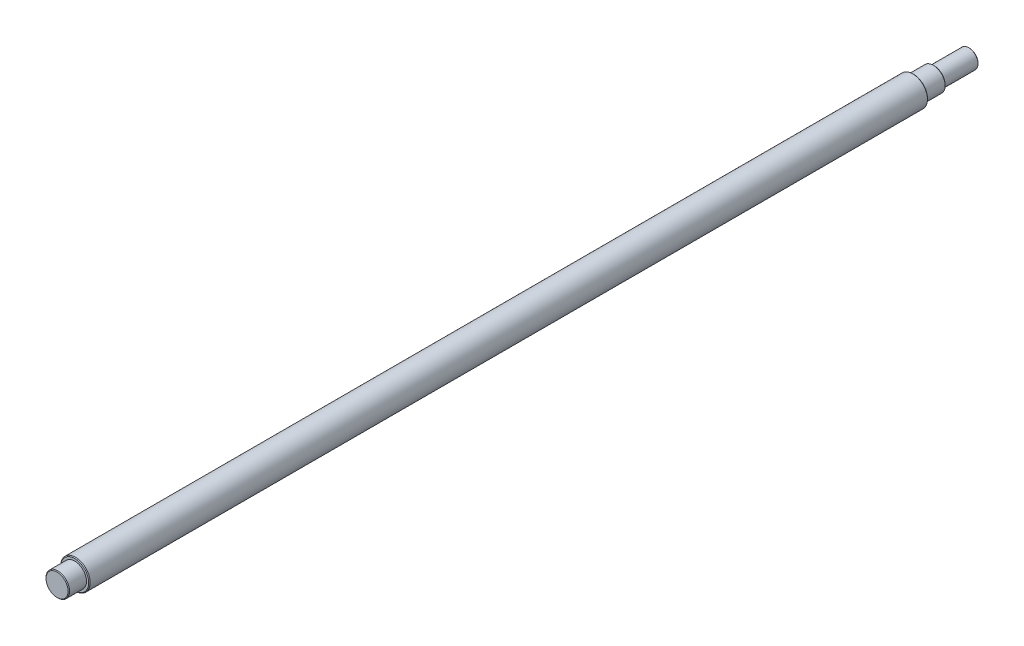
ISO-10303-21;
HEADER;
FILE_DESCRIPTION(('STEP AP214'),'2;1');
FILE_NAME('part.step','',(''),(''),'','','');
FILE_SCHEMA(('AUTOMOTIVE_DESIGN { 1 0 10303 214 1 1 1 1 }'));
ENDSEC;
DATA;
#1=APPLICATION_CONTEXT('core data for automotive mechanical design processes');
#2=APPLICATION_PROTOCOL_DEFINITION('international standard','automotive_design',2000,#1);
#3=PRODUCT_CONTEXT('',#1,'mechanical');
#4=PRODUCT('Part','Part','',(#3));
#5=PRODUCT_RELATED_PRODUCT_CATEGORY('part','',(#4));
#6=PRODUCT_DEFINITION_FORMATION('','',#4);
#7=PRODUCT_DEFINITION_CONTEXT('part definition',#1,'design');
#8=PRODUCT_DEFINITION('design','',#6,#7);
#9=PRODUCT_DEFINITION_SHAPE('','',#8);
#10=(LENGTH_UNIT() NAMED_UNIT(*) SI_UNIT(.MILLI.,.METRE.));
#11=(NAMED_UNIT(*) PLANE_ANGLE_UNIT() SI_UNIT($,.RADIAN.));
#12=(NAMED_UNIT(*) SI_UNIT($,.STERADIAN.) SOLID_ANGLE_UNIT());
#13=UNCERTAINTY_MEASURE_WITH_UNIT(LENGTH_MEASURE(1.E-05),#10,'distance_accuracy_value','');
#14=(GEOMETRIC_REPRESENTATION_CONTEXT(3) GLOBAL_UNCERTAINTY_ASSIGNED_CONTEXT((#13)) GLOBAL_UNIT_ASSIGNED_CONTEXT((#10,
#11,#12)) REPRESENTATION_CONTEXT('',''));
#15=CARTESIAN_POINT('',(0.,0.,0.));
#16=DIRECTION('',(0.,0.,1.));
#17=DIRECTION('',(1.,0.,0.));
#18=AXIS2_PLACEMENT_3D('',#15,#16,#17);
#19=CARTESIAN_POINT('',(0.,0.,304.));
#20=DIRECTION('',(0.,0.,-1.));
#21=DIRECTION('',(-1.,0.,0.));
#22=AXIS2_PLACEMENT_3D('',#19,#20,#21);
#23=PLANE('',#22);
#24=CARTESIAN_POINT('',(0.,0.,304.));
#25=DIRECTION('',(0.,0.,-1.));
#26=DIRECTION('',(-1.,0.,0.));
#27=AXIS2_PLACEMENT_3D('',#24,#25,#26);
#28=CIRCLE('',#27,4.74999999995607);
#29=CARTESIAN_POINT('',(-4.74999999995607,0.,304.));
#30=VERTEX_POINT('',#29);
#31=EDGE_CURVE('E65',#30,#30,#28,.F.);
#32=ORIENTED_EDGE('',*,*,#31,.T.);
#33=EDGE_LOOP('',(#32));
#34=FACE_BOUND('',#33,.T.);
#35=CARTESIAN_POINT('',(0.,0.,304.));
#36=DIRECTION('',(0.,0.,-1.));
#37=DIRECTION('',(-1.,0.,0.));
#38=AXIS2_PLACEMENT_3D('',#35,#36,#37);
#39=CIRCLE('',#38,4.);
#40=CARTESIAN_POINT('',(-4.,0.,304.));
#41=VERTEX_POINT('',#40);
#42=EDGE_CURVE('E68',#41,#41,#39,.F.);
#43=ORIENTED_EDGE('',*,*,#42,.F.);
#44=EDGE_LOOP('',(#43));
#45=FACE_BOUND('',#44,.T.);
#46=ADVANCED_FACE('F30',(#34,#45),#23,.F.);
#47=CARTESIAN_POINT('',(0.,0.,12.));
#48=DIRECTION('',(0.,0.,-1.));
#49=DIRECTION('',(-1.,0.,0.));
#50=AXIS2_PLACEMENT_3D('',#47,#48,#49);
#51=PLANE('',#50);
#52=CARTESIAN_POINT('',(0.,0.,12.));
#53=DIRECTION('',(0.,0.,-1.));
#54=DIRECTION('',(-1.,0.,0.));
#55=AXIS2_PLACEMENT_3D('',#52,#53,#54);
#56=CIRCLE('',#55,3.7499999999562);
#57=CARTESIAN_POINT('',(-3.7499999999562,0.,12.));
#58=VERTEX_POINT('',#57);
#59=EDGE_CURVE('E37',#58,#58,#56,.T.);
#60=ORIENTED_EDGE('',*,*,#59,.T.);
#61=EDGE_LOOP('',(#60));
#62=FACE_BOUND('',#61,.T.);
#63=CARTESIAN_POINT('',(0.,0.,12.));
#64=DIRECTION('',(0.,0.,-1.));
#65=DIRECTION('',(-1.,0.,0.));
#66=AXIS2_PLACEMENT_3D('',#63,#64,#65);
#67=CIRCLE('',#66,3.175);
#68=CARTESIAN_POINT('',(-3.175,0.,12.));
#69=VERTEX_POINT('',#68);
#70=EDGE_CURVE('E74',#69,#69,#67,.T.);
#71=ORIENTED_EDGE('',*,*,#70,.F.);
#72=EDGE_LOOP('',(#71));
#73=FACE_BOUND('',#72,.T.);
#74=ADVANCED_FACE('F80',(#62,#73),#51,.T.);
#75=CARTESIAN_POINT('',(0.,0.,19.));
#76=DIRECTION('',(0.,0.,-1.));
#77=DIRECTION('',(-1.,0.,0.));
#78=AXIS2_PLACEMENT_3D('',#75,#76,#77);
#79=PLANE('',#78);
#80=CARTESIAN_POINT('',(0.,0.,19.));
#81=DIRECTION('',(0.,0.,-1.));
#82=DIRECTION('',(-1.,0.,0.));
#83=AXIS2_PLACEMENT_3D('',#80,#81,#82);
#84=CIRCLE('',#83,4.74999999995609);
#85=CARTESIAN_POINT('',(-4.74999999995609,0.,19.));
#86=VERTEX_POINT('',#85);
#87=EDGE_CURVE('E50',#86,#86,#84,.T.);
#88=ORIENTED_EDGE('',*,*,#87,.T.);
#89=EDGE_LOOP('',(#88));
#90=FACE_BOUND('',#89,.T.);
#91=CARTESIAN_POINT('',(0.,0.,19.));
#92=DIRECTION('',(0.,0.,-1.));
#93=DIRECTION('',(-1.,0.,0.));
#94=AXIS2_PLACEMENT_3D('',#91,#92,#93);
#95=CIRCLE('',#94,4.);
#96=CARTESIAN_POINT('',(4.,0.,19.));
#97=VERTEX_POINT('',#96);
#98=EDGE_CURVE('E71',#97,#97,#95,.T.);
#99=ORIENTED_EDGE('',*,*,#98,.F.);
#100=EDGE_LOOP('',(#99));
#101=FACE_BOUND('',#100,.T.);
#102=ADVANCED_FACE('F82',(#90,#101),#79,.T.);
#103=CARTESIAN_POINT('',(0.,0.,19.));
#104=DIRECTION('',(0.,0.,1.));
#105=DIRECTION('',(1.,0.,0.));
#106=AXIS2_PLACEMENT_3D('',#103,#104,#105);
#107=CYLINDRICAL_SURFACE('',#106,5.);
#108=CARTESIAN_POINT('',(0.,0.,303.749999999956));
#109=DIRECTION('',(0.,0.,-1.));
#110=DIRECTION('',(-1.,0.,0.));
#111=AXIS2_PLACEMENT_3D('',#108,#109,#110);
#112=CIRCLE('',#111,5.);
#113=CARTESIAN_POINT('',(-5.,0.,303.749999999956));
#114=VERTEX_POINT('',#113);
#115=EDGE_CURVE('E59',#114,#114,#112,.T.);
#116=ORIENTED_EDGE('',*,*,#115,.T.);
#117=EDGE_LOOP('',(#116));
#118=FACE_BOUND('',#117,.T.);
#119=CARTESIAN_POINT('',(0.,0.,19.2500000000439));
#120=DIRECTION('',(0.,0.,-1.));
#121=DIRECTION('',(-1.,0.,0.));
#122=AXIS2_PLACEMENT_3D('',#119,#120,#121);
#123=CIRCLE('',#122,5.);
#124=CARTESIAN_POINT('',(-5.,0.,19.2500000000439));
#125=VERTEX_POINT('',#124);
#126=EDGE_CURVE('E62',#125,#125,#123,.F.);
#127=ORIENTED_EDGE('',*,*,#126,.T.);
#128=EDGE_LOOP('',(#127));
#129=FACE_BOUND('',#128,.T.);
#130=ADVANCED_FACE('F88',(#118,#129),#107,.T.);
#131=CARTESIAN_POINT('',(0.,0.,12.));
#132=DIRECTION('',(0.,0.,1.));
#133=DIRECTION('',(1.,0.,0.));
#134=AXIS2_PLACEMENT_3D('',#131,#132,#133);
#135=CYLINDRICAL_SURFACE('',#134,4.);
#136=CARTESIAN_POINT('',(0.,0.,12.2500000000438));
#137=DIRECTION('',(0.,0.,-1.));
#138=DIRECTION('',(-1.,0.,0.));
#139=AXIS2_PLACEMENT_3D('',#136,#137,#138);
#140=CIRCLE('',#139,4.);
#141=CARTESIAN_POINT('',(4.,0.,12.2500000000438));
#142=VERTEX_POINT('',#141);
#143=EDGE_CURVE('E10',#142,#142,#140,.F.);
#144=CARTESIAN_POINT('',(4.,0.,12.2500000000438));
#145=CARTESIAN_POINT('',(4.,0.,12.3203125000434));
#146=CARTESIAN_POINT('',(4.,0.,12.3906250000429));
#147=CARTESIAN_POINT('',(4.,0.,12.531250000042));
#148=CARTESIAN_POINT('',(4.,0.,12.6015625000415));
#149=CARTESIAN_POINT('',(4.,0.,12.7421875000406));
#150=CARTESIAN_POINT('',(4.,0.,12.8125000000402));
#151=CARTESIAN_POINT('',(4.,0.,12.9531250000392));
#152=CARTESIAN_POINT('',(4.,0.,13.0234375000388));
#153=CARTESIAN_POINT('',(4.,0.,13.1640625000379));
#154=CARTESIAN_POINT('',(4.,0.,13.2343750000374));
#155=CARTESIAN_POINT('',(4.,0.,13.3750000000365));
#156=CARTESIAN_POINT('',(4.,0.,13.4453125000361));
#157=CARTESIAN_POINT('',(4.,0.,13.5859375000351));
#158=CARTESIAN_POINT('',(4.,0.,13.6562500000347));
#159=CARTESIAN_POINT('',(4.,0.,13.7968750000338));
#160=CARTESIAN_POINT('',(4.,0.,13.8671875000333));
#161=CARTESIAN_POINT('',(4.,0.,14.0078125000324));
#162=CARTESIAN_POINT('',(4.,0.,14.078125000032));
#163=CARTESIAN_POINT('',(4.,0.,14.218750000031));
#164=CARTESIAN_POINT('',(4.,0.,14.2890625000306));
#165=CARTESIAN_POINT('',(4.,0.,14.4296875000297));
#166=CARTESIAN_POINT('',(4.,0.,14.5000000000292));
#167=CARTESIAN_POINT('',(4.,0.,14.6406250000283));
#168=CARTESIAN_POINT('',(4.,0.,14.7109375000278));
#169=CARTESIAN_POINT('',(4.,0.,14.8515625000269));
#170=CARTESIAN_POINT('',(4.,0.,14.9218750000265));
#171=CARTESIAN_POINT('',(4.,0.,15.0625000000256));
#172=CARTESIAN_POINT('',(4.,0.,15.1328125000251));
#173=CARTESIAN_POINT('',(4.,0.,15.2734375000242));
#174=CARTESIAN_POINT('',(4.,0.,15.3437500000237));
#175=CARTESIAN_POINT('',(4.,0.,15.4843750000228));
#176=CARTESIAN_POINT('',(4.,0.,15.5546875000224));
#177=CARTESIAN_POINT('',(4.,0.,15.6953125000215));
#178=CARTESIAN_POINT('',(4.,0.,15.765625000021));
#179=CARTESIAN_POINT('',(4.,0.,15.9062500000201));
#180=CARTESIAN_POINT('',(4.,0.,15.9765625000196));
#181=CARTESIAN_POINT('',(4.,0.,16.1171875000187));
#182=CARTESIAN_POINT('',(4.,0.,16.1875000000183));
#183=CARTESIAN_POINT('',(4.,0.,16.3281250000174));
#184=CARTESIAN_POINT('',(4.,0.,16.3984375000169));
#185=CARTESIAN_POINT('',(4.,0.,16.539062500016));
#186=CARTESIAN_POINT('',(4.,0.,16.6093750000155));
#187=CARTESIAN_POINT('',(4.,0.,16.7500000000146));
#188=CARTESIAN_POINT('',(4.,0.,16.8203125000142));
#189=CARTESIAN_POINT('',(4.,0.,16.9609375000132));
#190=CARTESIAN_POINT('',(4.,0.,17.0312500000128));
#191=CARTESIAN_POINT('',(4.,0.,17.1718750000119));
#192=CARTESIAN_POINT('',(4.,0.,17.2421875000114));
#193=CARTESIAN_POINT('',(4.,0.,17.3828125000105));
#194=CARTESIAN_POINT('',(4.,0.,17.4531250000101));
#195=CARTESIAN_POINT('',(4.,0.,17.5937500000091));
#196=CARTESIAN_POINT('',(4.,0.,17.6640625000087));
#197=CARTESIAN_POINT('',(4.,0.,17.8046875000078));
#198=CARTESIAN_POINT('',(4.,0.,17.8750000000073));
#199=CARTESIAN_POINT('',(4.,0.,18.0156250000064));
#200=CARTESIAN_POINT('',(4.,0.,18.085937500006));
#201=CARTESIAN_POINT('',(4.,0.,18.226562500005));
#202=CARTESIAN_POINT('',(4.,0.,18.2968750000046));
#203=CARTESIAN_POINT('',(4.,0.,18.4375000000037));
#204=CARTESIAN_POINT('',(4.,0.,18.5078125000032));
#205=CARTESIAN_POINT('',(4.,0.,18.6484375000023));
#206=CARTESIAN_POINT('',(4.,0.,18.7187500000018));
#207=CARTESIAN_POINT('',(4.,0.,18.8593750000009));
#208=CARTESIAN_POINT('',(4.,0.,18.9296875000005));
#209=CARTESIAN_POINT('',(4.,0.,19.));
#210=B_SPLINE_CURVE_WITH_KNOTS('',3,(#144,#145,#146,#147,#148,#149,#150,#151,#152,#153,#154,
#155,#156,#157,#158,#159,#160,#161,#162,#163,#164,#165,#166,#167,#168,#169,#170,#171,#172,#173,
#174,#175,#176,#177,#178,#179,#180,#181,#182,#183,#184,#185,#186,#187,#188,#189,#190,#191,#192,
#193,#194,#195,#196,#197,#198,#199,#200,#201,#202,#203,#204,#205,#206,#207,#208,#209),
.UNSPECIFIED.,.F.,.F.,(4,2,2,2,2,2,2,2,2,2,2,2,2,2,2,2,2,2,2,2,2,2,2,2,2,2,2,2,2,2,2,2,4),(0.,
0.210937499998632,0.421874999997263,0.632812499995895,0.843749999994526,1.05468749999316,
1.26562499999179,1.47656249999042,1.68749999998905,1.89843749998768,2.10937499998631,
2.32031249998495,2.53124999998358,2.74218749998221,2.95312499998084,3.16406249997947,
3.37499999997811,3.58593749997674,3.79687499997537,4.007812499974,4.21874999997263,
4.42968749997126,4.64062499996989,4.85156249996853,5.06249999996716,5.27343749996579,
5.48437499996442,5.69531249996305,5.90624999996168,6.11718749996031,6.32812499995894,
6.53906249995758,6.74999999995621),.UNSPECIFIED.);
#211=EDGE_CURVE('BSEAM96',#142,#97,#210,.T.);
#212=ORIENTED_EDGE('',*,*,#143,.T.);
#213=ORIENTED_EDGE('',*,*,#98,.T.);
#214=ORIENTED_EDGE('',*,*,#211,.T.);
#215=ORIENTED_EDGE('',*,*,#211,.F.);
#216=EDGE_LOOP('',(#212,#214,#213,#215));
#217=FACE_BOUND('',#216,.T.);
#218=ADVANCED_FACE('F96',(#217),#135,.T.);
#219=CARTESIAN_POINT('',(0.,0.,0.));
#220=DIRECTION('',(0.,0.,1.));
#221=DIRECTION('',(1.,0.,0.));
#222=AXIS2_PLACEMENT_3D('',#219,#220,#221);
#223=CYLINDRICAL_SURFACE('',#222,3.175);
#224=CARTESIAN_POINT('',(0.,0.,0.250000000043937));
#225=DIRECTION('',(0.,0.,-1.));
#226=DIRECTION('',(-1.,0.,0.));
#227=AXIS2_PLACEMENT_3D('',#224,#225,#226);
#228=CIRCLE('',#227,3.175);
#229=CARTESIAN_POINT('',(-3.175,0.,0.250000000043937));
#230=VERTEX_POINT('',#229);
#231=EDGE_CURVE('E53',#230,#230,#228,.F.);
#232=ORIENTED_EDGE('',*,*,#231,.T.);
#233=EDGE_LOOP('',(#232));
#234=FACE_BOUND('',#233,.T.);
#235=ORIENTED_EDGE('',*,*,#70,.T.);
#236=EDGE_LOOP('',(#235));
#237=FACE_BOUND('',#236,.T.);
#238=ADVANCED_FACE('F78',(#234,#237),#223,.T.);
#239=CARTESIAN_POINT('',(0.,0.,0.));
#240=DIRECTION('',(0.,0.,-1.));
#241=DIRECTION('',(-1.,0.,0.));
#242=AXIS2_PLACEMENT_3D('',#239,#240,#241);
#243=PLANE('',#242);
#244=CARTESIAN_POINT('',(0.,0.,0.));
#245=DIRECTION('',(0.,0.,-1.));
#246=DIRECTION('',(-1.,0.,0.));
#247=AXIS2_PLACEMENT_3D('',#244,#245,#246);
#248=CIRCLE('',#247,2.9249999999561);
#249=CARTESIAN_POINT('',(-2.9249999999561,0.,0.));
#250=VERTEX_POINT('',#249);
#251=EDGE_CURVE('E56',#250,#250,#248,.T.);
#252=ORIENTED_EDGE('',*,*,#251,.T.);
#253=EDGE_LOOP('',(#252));
#254=FACE_BOUND('',#253,.T.);
#255=ADVANCED_FACE('F131',(#254),#243,.T.);
#256=CARTESIAN_POINT('',(0.,0.,310.));
#257=DIRECTION('',(0.,0.,-1.));
#258=DIRECTION('',(-1.,0.,0.));
#259=AXIS2_PLACEMENT_3D('',#256,#257,#258);
#260=CYLINDRICAL_SURFACE('',#259,4.);
#261=CARTESIAN_POINT('',(0.,0.,309.749999999956));
#262=DIRECTION('',(0.,0.,1.));
#263=DIRECTION('',(1.,0.,0.));
#264=AXIS2_PLACEMENT_3D('',#261,#262,#263);
#265=CIRCLE('',#264,4.);
#266=CARTESIAN_POINT('',(4.,0.,309.749999999956));
#267=VERTEX_POINT('',#266);
#268=EDGE_CURVE('E41',#267,#267,#265,.F.);
#269=ORIENTED_EDGE('',*,*,#268,.T.);
#270=EDGE_LOOP('',(#269));
#271=FACE_BOUND('',#270,.T.);
#272=ORIENTED_EDGE('',*,*,#42,.T.);
#273=EDGE_LOOP('',(#272));
#274=FACE_BOUND('',#273,.T.);
#275=ADVANCED_FACE('F126',(#271,#274),#260,.T.);
#276=CARTESIAN_POINT('',(0.,0.,310.));
#277=DIRECTION('',(0.,0.,1.));
#278=DIRECTION('',(1.,0.,0.));
#279=AXIS2_PLACEMENT_3D('',#276,#277,#278);
#280=PLANE('',#279);
#281=CARTESIAN_POINT('',(0.,0.,310.));
#282=DIRECTION('',(0.,0.,1.));
#283=DIRECTION('',(1.,0.,0.));
#284=AXIS2_PLACEMENT_3D('',#281,#282,#283);
#285=CIRCLE('',#284,3.74999999995604);
#286=CARTESIAN_POINT('',(3.74999999995604,0.,310.));
#287=VERTEX_POINT('',#286);
#288=EDGE_CURVE('E45',#287,#287,#285,.T.);
#289=ORIENTED_EDGE('',*,*,#288,.T.);
#290=EDGE_LOOP('',(#289));
#291=FACE_BOUND('',#290,.T.);
#292=ADVANCED_FACE('F106',(#291),#280,.T.);
#293=CARTESIAN_POINT('',(0.,0.,304.));
#294=DIRECTION('',(0.,0.,-1.));
#295=DIRECTION('',(-1.,0.,0.));
#296=AXIS2_PLACEMENT_3D('',#293,#294,#295);
#297=CONICAL_SURFACE('',#296,4.74999999995607,0.785398163397551);
#298=ORIENTED_EDGE('',*,*,#115,.F.);
#299=EDGE_LOOP('',(#298));
#300=FACE_BOUND('',#299,.T.);
#301=ORIENTED_EDGE('',*,*,#31,.F.);
#302=EDGE_LOOP('',(#301));
#303=FACE_BOUND('',#302,.T.);
#304=ADVANCED_FACE('F102',(#300,#303),#297,.T.);
#305=CARTESIAN_POINT('',(0.,0.,0.));
#306=DIRECTION('',(0.,0.,1.));
#307=DIRECTION('',(1.,0.,0.));
#308=AXIS2_PLACEMENT_3D('',#305,#306,#307);
#309=CONICAL_SURFACE('',#308,2.9249999999561,0.785398163397407);
#310=ORIENTED_EDGE('',*,*,#231,.F.);
#311=EDGE_LOOP('',(#310));
#312=FACE_BOUND('',#311,.T.);
#313=ORIENTED_EDGE('',*,*,#251,.F.);
#314=EDGE_LOOP('',(#313));
#315=FACE_BOUND('',#314,.T.);
#316=ADVANCED_FACE('F105',(#312,#315),#309,.T.);
#317=CARTESIAN_POINT('',(0.,0.,19.2500000000439));
#318=DIRECTION('',(0.,0.,1.));
#319=DIRECTION('',(1.,0.,0.));
#320=AXIS2_PLACEMENT_3D('',#317,#318,#319);
#321=CONICAL_SURFACE('',#320,5.,0.78539816339744);
#322=ORIENTED_EDGE('',*,*,#87,.F.);
#323=EDGE_LOOP('',(#322));
#324=FACE_BOUND('',#323,.T.);
#325=ORIENTED_EDGE('',*,*,#126,.F.);
#326=EDGE_LOOP('',(#325));
#327=FACE_BOUND('',#326,.T.);
#328=ADVANCED_FACE('F110',(#324,#327),#321,.T.);
#329=CARTESIAN_POINT('',(0.,0.,310.));
#330=DIRECTION('',(0.,0.,-1.));
#331=DIRECTION('',(-1.,0.,0.));
#332=AXIS2_PLACEMENT_3D('',#329,#330,#331);
#333=CONICAL_SURFACE('',#332,3.74999999995604,0.785398163397497);
#334=ORIENTED_EDGE('',*,*,#268,.F.);
#335=EDGE_LOOP('',(#334));
#336=FACE_BOUND('',#335,.T.);
#337=ORIENTED_EDGE('',*,*,#288,.F.);
#338=EDGE_LOOP('',(#337));
#339=FACE_BOUND('',#338,.T.);
#340=ADVANCED_FACE('F113',(#336,#339),#333,.T.);
#341=CARTESIAN_POINT('',(0.,0.,12.));
#342=DIRECTION('',(0.,0.,1.));
#343=DIRECTION('',(1.,0.,0.));
#344=AXIS2_PLACEMENT_3D('',#341,#342,#343);
#345=CONICAL_SURFACE('',#344,3.7499999999562,0.785398163397452);
#346=ORIENTED_EDGE('',*,*,#143,.F.);
#347=EDGE_LOOP('',(#346));
#348=FACE_BOUND('',#347,.T.);
#349=ORIENTED_EDGE('',*,*,#59,.F.);
#350=EDGE_LOOP('',(#349));
#351=FACE_BOUND('',#350,.T.);
#352=ADVANCED_FACE('F32',(#348,#351),#345,.T.);
#353=CLOSED_SHELL('',(#46,#74,#102,#130,#218,#238,#255,#275,#292,#304,#316,#328,#340,#352));
#354=MANIFOLD_SOLID_BREP('B2',#353);
#355=ADVANCED_BREP_SHAPE_REPRESENTATION('',(#18,#354),#14);
#356=SHAPE_DEFINITION_REPRESENTATION(#9,#355);
ENDSEC;
END-ISO-10303-21;
